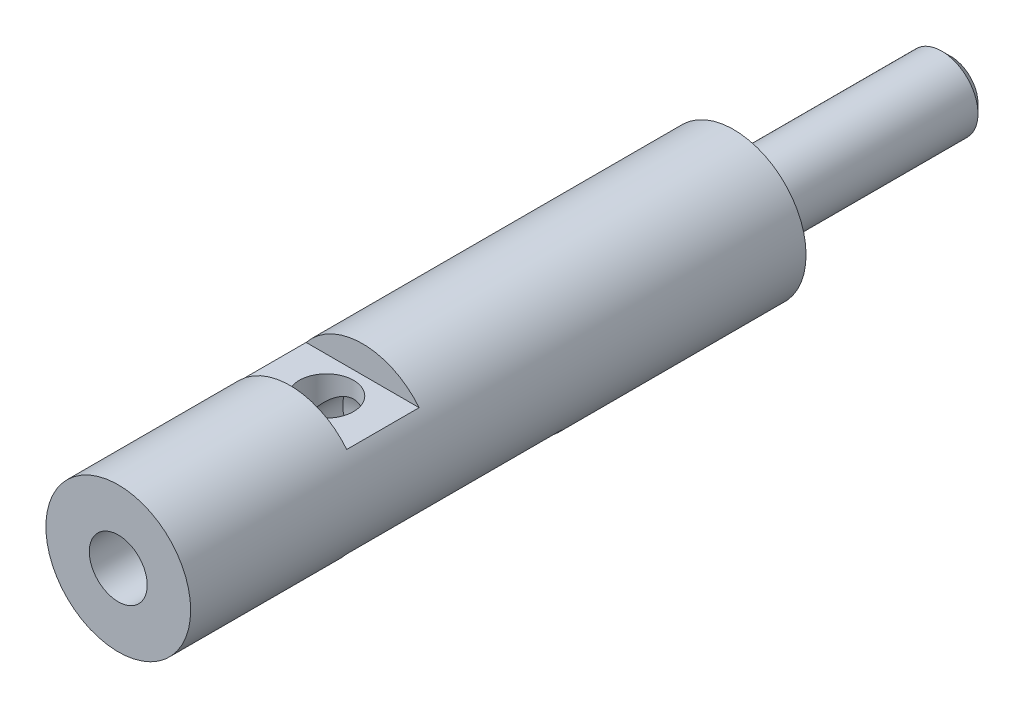
ISO-10303-21;
HEADER;
FILE_DESCRIPTION(('STEP AP214'),'2;1');
FILE_NAME('part.step','',(''),(''),'','','');
FILE_SCHEMA(('AUTOMOTIVE_DESIGN { 1 0 10303 214 1 1 1 1 }'));
ENDSEC;
DATA;
#1=APPLICATION_CONTEXT('core data for automotive mechanical design processes');
#2=APPLICATION_PROTOCOL_DEFINITION('international standard','automotive_design',2000,#1);
#3=PRODUCT_CONTEXT('',#1,'mechanical');
#4=PRODUCT('Part','Part','',(#3));
#5=PRODUCT_RELATED_PRODUCT_CATEGORY('part','',(#4));
#6=PRODUCT_DEFINITION_FORMATION('','',#4);
#7=PRODUCT_DEFINITION_CONTEXT('part definition',#1,'design');
#8=PRODUCT_DEFINITION('design','',#6,#7);
#9=PRODUCT_DEFINITION_SHAPE('','',#8);
#10=(LENGTH_UNIT() NAMED_UNIT(*) SI_UNIT(.MILLI.,.METRE.));
#11=(NAMED_UNIT(*) PLANE_ANGLE_UNIT() SI_UNIT($,.RADIAN.));
#12=(NAMED_UNIT(*) SI_UNIT($,.STERADIAN.) SOLID_ANGLE_UNIT());
#13=UNCERTAINTY_MEASURE_WITH_UNIT(LENGTH_MEASURE(1.E-05),#10,'distance_accuracy_value','');
#14=(GEOMETRIC_REPRESENTATION_CONTEXT(3) GLOBAL_UNCERTAINTY_ASSIGNED_CONTEXT((#13)) GLOBAL_UNIT_ASSIGNED_CONTEXT((#10,
#11,#12)) REPRESENTATION_CONTEXT('',''));
#15=CARTESIAN_POINT('',(0.,0.,0.));
#16=DIRECTION('',(0.,0.,1.));
#17=DIRECTION('',(1.,0.,0.));
#18=AXIS2_PLACEMENT_3D('',#15,#16,#17);
#19=CARTESIAN_POINT('',(0.,0.,34.));
#20=DIRECTION('',(0.,0.,-1.));
#21=DIRECTION('',(-1.,0.,0.));
#22=AXIS2_PLACEMENT_3D('',#19,#20,#21);
#23=CYLINDRICAL_SURFACE('',#22,4.);
#24=DIRECTION('',(0.,0.,-1.));
#25=VECTOR('',#24,1.);
#26=CARTESIAN_POINT('',(3.1224989991992,-2.5,34.));
#27=LINE('',#26,#25);
#28=CARTESIAN_POINT('',(3.1224989991992,-2.5,24.5));
#29=VERTEX_POINT('',#28);
#30=CARTESIAN_POINT('',(3.1224989991992,-2.5,12.5));
#31=VERTEX_POINT('',#30);
#32=EDGE_CURVE('E11',#29,#31,#27,.T.);
#33=ORIENTED_EDGE('',*,*,#32,.T.);
#34=CARTESIAN_POINT('',(0.,0.,12.5));
#35=DIRECTION('',(0.,0.,-1.));
#36=DIRECTION('',(-1.,0.,0.));
#37=AXIS2_PLACEMENT_3D('',#34,#35,#36);
#38=CIRCLE('',#37,4.);
#39=CARTESIAN_POINT('',(-3.1224989991992,-2.5,12.5));
#40=VERTEX_POINT('',#39);
#41=EDGE_CURVE('E99',#31,#40,#38,.T.);
#42=ORIENTED_EDGE('',*,*,#41,.T.);
#43=DIRECTION('',(0.,0.,-1.));
#44=VECTOR('',#43,1.);
#45=CARTESIAN_POINT('',(-3.1224989991992,-2.5,34.));
#46=LINE('',#45,#44);
#47=CARTESIAN_POINT('',(-3.1224989991992,-2.5,24.5));
#48=VERTEX_POINT('',#47);
#49=EDGE_CURVE('E102',#40,#48,#46,.F.);
#50=ORIENTED_EDGE('',*,*,#49,.T.);
#51=CARTESIAN_POINT('',(0.,0.,24.5));
#52=DIRECTION('',(0.,0.,1.));
#53=DIRECTION('',(1.,0.,0.));
#54=AXIS2_PLACEMENT_3D('',#51,#52,#53);
#55=CIRCLE('',#54,4.);
#56=EDGE_CURVE('E48',#48,#29,#55,.T.);
#57=ORIENTED_EDGE('',*,*,#56,.T.);
#58=EDGE_LOOP('',(#33,#42,#50,#57));
#59=FACE_BOUND('',#58,.T.);
#60=CARTESIAN_POINT('',(0.,0.,24.5));
#61=DIRECTION('',(0.,0.,1.));
#62=DIRECTION('',(1.,0.,0.));
#63=AXIS2_PLACEMENT_3D('',#60,#61,#62);
#64=CIRCLE('',#63,4.);
#65=CARTESIAN_POINT('',(3.1224989991992,2.5,24.5));
#66=VERTEX_POINT('',#65);
#67=CARTESIAN_POINT('',(-3.1224989991992,2.5,24.5));
#68=VERTEX_POINT('',#67);
#69=EDGE_CURVE('E92',#66,#68,#64,.T.);
#70=ORIENTED_EDGE('',*,*,#69,.T.);
#71=DIRECTION('',(0.,0.,-1.));
#72=VECTOR('',#71,1.);
#73=CARTESIAN_POINT('',(-3.1224989991992,2.5,34.));
#74=LINE('',#73,#72);
#75=CARTESIAN_POINT('',(-3.1224989991992,2.5,20.5));
#76=VERTEX_POINT('',#75);
#77=EDGE_CURVE('E96',#68,#76,#74,.T.);
#78=ORIENTED_EDGE('',*,*,#77,.T.);
#79=CARTESIAN_POINT('',(0.,0.,20.5));
#80=DIRECTION('',(0.,0.,-1.));
#81=DIRECTION('',(-1.,0.,0.));
#82=AXIS2_PLACEMENT_3D('',#79,#80,#81);
#83=CIRCLE('',#82,4.);
#84=CARTESIAN_POINT('',(3.1224989991992,2.5,20.5));
#85=VERTEX_POINT('',#84);
#86=EDGE_CURVE('E85',#76,#85,#83,.T.);
#87=ORIENTED_EDGE('',*,*,#86,.T.);
#88=DIRECTION('',(0.,0.,-1.));
#89=VECTOR('',#88,1.);
#90=CARTESIAN_POINT('',(3.1224989991992,2.5,34.));
#91=LINE('',#90,#89);
#92=EDGE_CURVE('E93',#85,#66,#91,.F.);
#93=ORIENTED_EDGE('',*,*,#92,.T.);
#94=EDGE_LOOP('',(#70,#78,#87,#93));
#95=FACE_BOUND('',#94,.T.);
#96=CARTESIAN_POINT('',(0.,0.,34.));
#97=DIRECTION('',(0.,0.,1.));
#98=DIRECTION('',(1.,0.,0.));
#99=AXIS2_PLACEMENT_3D('',#96,#97,#98);
#100=CIRCLE('',#99,4.);
#101=CARTESIAN_POINT('',(4.,0.,34.));
#102=VERTEX_POINT('',#101);
#103=EDGE_CURVE('E139',#102,#102,#100,.T.);
#104=ORIENTED_EDGE('',*,*,#103,.F.);
#105=EDGE_LOOP('',(#104));
#106=FACE_BOUND('',#105,.T.);
#107=CARTESIAN_POINT('',(0.,0.,0.));
#108=DIRECTION('',(0.,0.,1.));
#109=DIRECTION('',(1.,0.,0.));
#110=AXIS2_PLACEMENT_3D('',#107,#108,#109);
#111=CIRCLE('',#110,4.);
#112=CARTESIAN_POINT('',(4.,0.,0.));
#113=VERTEX_POINT('',#112);
#114=EDGE_CURVE('E134',#113,#113,#111,.T.);
#115=ORIENTED_EDGE('',*,*,#114,.T.);
#116=EDGE_LOOP('',(#115));
#117=FACE_BOUND('',#116,.T.);
#118=ADVANCED_FACE('F39',(#59,#95,#106,#117),#23,.T.);
#119=CARTESIAN_POINT('',(0.,0.,34.));
#120=DIRECTION('',(0.,0.,1.));
#121=DIRECTION('',(1.,0.,0.));
#122=AXIS2_PLACEMENT_3D('',#119,#120,#121);
#123=PLANE('',#122);
#124=CARTESIAN_POINT('',(0.,0.,34.));
#125=DIRECTION('',(0.,0.,1.));
#126=DIRECTION('',(1.,0.,0.));
#127=AXIS2_PLACEMENT_3D('',#124,#125,#126);
#128=CIRCLE('',#127,1.59999999999999);
#129=CARTESIAN_POINT('',(1.59999999999999,0.,34.));
#130=VERTEX_POINT('',#129);
#131=EDGE_CURVE('E116',#130,#130,#128,.T.);
#132=ORIENTED_EDGE('',*,*,#131,.F.);
#133=EDGE_LOOP('',(#132));
#134=FACE_BOUND('',#133,.T.);
#135=ORIENTED_EDGE('',*,*,#103,.T.);
#136=EDGE_LOOP('',(#135));
#137=FACE_BOUND('',#136,.T.);
#138=ADVANCED_FACE('F169',(#134,#137),#123,.T.);
#139=CARTESIAN_POINT('',(0.,0.,0.));
#140=DIRECTION('',(0.,0.,1.));
#141=DIRECTION('',(1.,0.,0.));
#142=AXIS2_PLACEMENT_3D('',#139,#140,#141);
#143=PLANE('',#142);
#144=CARTESIAN_POINT('',(0.,0.,0.));
#145=DIRECTION('',(0.,0.,-1.));
#146=DIRECTION('',(-1.,0.,0.));
#147=AXIS2_PLACEMENT_3D('',#144,#145,#146);
#148=CIRCLE('',#147,2.);
#149=CARTESIAN_POINT('',(-2.,0.,0.));
#150=VERTEX_POINT('',#149);
#151=EDGE_CURVE('E135',#150,#150,#148,.T.);
#152=ORIENTED_EDGE('',*,*,#151,.F.);
#153=EDGE_LOOP('',(#152));
#154=FACE_BOUND('',#153,.T.);
#155=ORIENTED_EDGE('',*,*,#114,.F.);
#156=EDGE_LOOP('',(#155));
#157=FACE_BOUND('',#156,.T.);
#158=ADVANCED_FACE('F165',(#154,#157),#143,.F.);
#159=CARTESIAN_POINT('',(0.,0.,-12.));
#160=DIRECTION('',(0.,0.,1.));
#161=DIRECTION('',(1.,0.,0.));
#162=AXIS2_PLACEMENT_3D('',#159,#160,#161);
#163=CYLINDRICAL_SURFACE('',#162,2.);
#164=CARTESIAN_POINT('',(0.,0.,-11.5));
#165=DIRECTION('',(0.,0.,-1.));
#166=DIRECTION('',(-1.,0.,0.));
#167=AXIS2_PLACEMENT_3D('',#164,#165,#166);
#168=CIRCLE('',#167,2.);
#169=CARTESIAN_POINT('',(-2.,0.,-11.5));
#170=VERTEX_POINT('',#169);
#171=EDGE_CURVE('E146',#170,#170,#168,.F.);
#172=ORIENTED_EDGE('',*,*,#171,.T.);
#173=EDGE_LOOP('',(#172));
#174=FACE_BOUND('',#173,.T.);
#175=ORIENTED_EDGE('',*,*,#151,.T.);
#176=EDGE_LOOP('',(#175));
#177=FACE_BOUND('',#176,.T.);
#178=ADVANCED_FACE('F151',(#174,#177),#163,.T.);
#179=CARTESIAN_POINT('',(0.,0.,-12.));
#180=DIRECTION('',(0.,0.,-1.));
#181=DIRECTION('',(-1.,0.,0.));
#182=AXIS2_PLACEMENT_3D('',#179,#180,#181);
#183=PLANE('',#182);
#184=CARTESIAN_POINT('',(0.,0.,-12.));
#185=DIRECTION('',(0.,0.,-1.));
#186=DIRECTION('',(-1.,0.,0.));
#187=AXIS2_PLACEMENT_3D('',#184,#185,#186);
#188=CIRCLE('',#187,1.5);
#189=CARTESIAN_POINT('',(-1.5,0.,-12.));
#190=VERTEX_POINT('',#189);
#191=EDGE_CURVE('E138',#190,#190,#188,.T.);
#192=ORIENTED_EDGE('',*,*,#191,.T.);
#193=EDGE_LOOP('',(#192));
#194=FACE_BOUND('',#193,.T.);
#195=ADVANCED_FACE('F157',(#194),#183,.T.);
#196=CARTESIAN_POINT('',(0.,0.,-12.));
#197=DIRECTION('',(0.,0.,1.));
#198=DIRECTION('',(1.,0.,0.));
#199=AXIS2_PLACEMENT_3D('',#196,#197,#198);
#200=CONICAL_SURFACE('',#199,1.5,0.785398163397441);
#201=ORIENTED_EDGE('',*,*,#171,.F.);
#202=EDGE_LOOP('',(#201));
#203=FACE_BOUND('',#202,.T.);
#204=ORIENTED_EDGE('',*,*,#191,.F.);
#205=EDGE_LOOP('',(#204));
#206=FACE_BOUND('',#205,.T.);
#207=ADVANCED_FACE('F42',(#203,#206),#200,.T.);
#208=CARTESIAN_POINT('',(0.,0.,20.));
#209=DIRECTION('',(0.,0.,1.));
#210=DIRECTION('',(1.,0.,0.));
#211=AXIS2_PLACEMENT_3D('',#208,#209,#210);
#212=CONICAL_SURFACE('',#211,1.6,1.02974425867665);
#213=CARTESIAN_POINT('',(0.,0.,19.0386230095559));
#214=VERTEX_POINT('',#213);
#215=VERTEX_LOOP('',#214);
#216=FACE_BOUND('',#215,.T.);
#217=CARTESIAN_POINT('',(0.,0.,20.));
#218=DIRECTION('',(0.,0.,1.));
#219=DIRECTION('',(1.,0.,0.));
#220=AXIS2_PLACEMENT_3D('',#217,#218,#219);
#221=CIRCLE('',#220,1.6);
#222=CARTESIAN_POINT('',(1.6,0.,20.));
#223=VERTEX_POINT('',#222);
#224=EDGE_CURVE('E119',#223,#223,#221,.T.);
#225=ORIENTED_EDGE('',*,*,#224,.T.);
#226=EDGE_LOOP('',(#225));
#227=FACE_BOUND('',#226,.T.);
#228=ADVANCED_FACE('F156',(#216,#227),#212,.F.);
#229=CARTESIAN_POINT('',(0.,0.,34.));
#230=DIRECTION('',(0.,0.,1.));
#231=DIRECTION('',(1.,0.,0.));
#232=AXIS2_PLACEMENT_3D('',#229,#230,#231);
#233=CYLINDRICAL_SURFACE('',#232,1.59999999999999);
#234=CARTESIAN_POINT('',(0.,1.59999999999999,24.));
#235=CARTESIAN_POINT('',(0.0684255819523122,1.59999100993067,23.9999909037022));
#236=CARTESIAN_POINT('',(0.136969761419658,1.59556467819543,23.9952718028662));
#237=CARTESIAN_POINT('',(0.271820864103849,1.57821703920185,23.9767460950131));
#238=CARTESIAN_POINT('',(0.338120531372212,1.56527051953187,23.9629125168593));
#239=CARTESIAN_POINT('',(0.466029039157558,1.53204181361779,23.9273026465164));
#240=CARTESIAN_POINT('',(0.527667983699462,1.51181264687308,23.9055837519526));
#241=CARTESIAN_POINT('',(0.645624057326148,1.46533125031908,23.8554641980768));
#242=CARTESIAN_POINT('',(0.701942648568488,1.43908068217026,23.827065382095));
#243=CARTESIAN_POINT('',(0.830488511004105,1.37023549959972,23.7521367718335));
#244=CARTESIAN_POINT('',(0.899909356040595,1.32532924968791,23.7029239827119));
#245=CARTESIAN_POINT('',(1.02730053831725,1.22924745848653,23.5961763274232));
#246=CARTESIAN_POINT('',(1.08523092595497,1.17805101301526,23.5386135908392));
#247=CARTESIAN_POINT('',(1.17078105057247,1.09156202300322,23.439079203753));
#248=CARTESIAN_POINT('',(1.20175833727903,1.05726375119173,23.3990591913821));
#249=CARTESIAN_POINT('',(1.25930890566738,0.988010810145917,23.3165013666502));
#250=CARTESIAN_POINT('',(1.28588281199331,0.953056234796473,23.2739639125663));
#251=CARTESIAN_POINT('',(1.33467012957743,0.883435608136693,23.1864135331328));
#252=CARTESIAN_POINT('',(1.35689236994422,0.848769112188214,23.1414058623666));
#253=CARTESIAN_POINT('',(1.39703622789021,0.780917148192493,23.0485005487822));
#254=CARTESIAN_POINT('',(1.4149635108398,0.747729776660345,23.0006068184924));
#255=CARTESIAN_POINT('',(1.44158488802393,0.694574099514457,22.9161177140525));
#256=CARTESIAN_POINT('',(1.45143080990949,0.673647073701062,22.8804953894909));
#257=CARTESIAN_POINT('',(1.46874054388632,0.635016088570959,22.8069631663552));
#258=CARTESIAN_POINT('',(1.47620697945578,0.617308588918451,22.7690558423236));
#259=CARTESIAN_POINT('',(1.48710185280875,0.590503680558253,22.6987798427245));
#260=CARTESIAN_POINT('',(1.49104694938892,0.580381760051782,22.6668967764258));
#261=CARTESIAN_POINT('',(1.49689488628612,0.565132788162447,22.6018105489845));
#262=CARTESIAN_POINT('',(1.49880415766172,0.559990012702319,22.56861189048));
#263=CARTESIAN_POINT('',(1.50037685312532,0.55576681639676,22.5014829327953));
#264=CARTESIAN_POINT('',(1.50002232907756,0.556734843369684,22.4675489177339));
#265=CARTESIAN_POINT('',(1.49707243273785,0.564613886898902,22.4004548043569));
#266=CARTESIAN_POINT('',(1.49447189716921,0.57153859691651,22.3672966702138));
#267=CARTESIAN_POINT('',(1.48583868780731,0.593691355415249,22.2892934477393));
#268=CARTESIAN_POINT('',(1.47883660489909,0.611158481279117,22.2452232391712));
#269=CARTESIAN_POINT('',(1.46163501869307,0.651230780563995,22.1601115299857));
#270=CARTESIAN_POINT('',(1.45142140048049,0.673858512219678,22.1190844071592));
#271=CARTESIAN_POINT('',(1.42705633043943,0.724130291338588,22.035704865551));
#272=CARTESIAN_POINT('',(1.41262082836606,0.752047417768084,21.9936038116937));
#273=CARTESIAN_POINT('',(1.38053670392534,0.809448984794801,21.9117405374917));
#274=CARTESIAN_POINT('',(1.36288484352601,0.838934983462933,21.8719807280305));
#275=CARTESIAN_POINT('',(1.3051305530831,0.928246532931989,21.7555777713488));
#276=CARTESIAN_POINT('',(1.26024681474811,0.988886891758775,21.6818687836925));
#277=CARTESIAN_POINT('',(1.15222226148889,1.11350800341083,21.5348573565179));
#278=CARTESIAN_POINT('',(1.08770668085877,1.17721837960241,21.4623292339281));
#279=CARTESIAN_POINT('',(0.941971511717624,1.29672721862757,21.3285064688438));
#280=CARTESIAN_POINT('',(0.860815124216925,1.35255430540365,21.2671709361242));
#281=CARTESIAN_POINT('',(0.715544871064882,1.43250376355303,21.1800618011488));
#282=CARTESIAN_POINT('',(0.656464639142303,1.46066194156336,21.1495806370149));
#283=CARTESIAN_POINT('',(0.53238020259496,1.51030557076396,21.0960323247324));
#284=CARTESIAN_POINT('',(0.467379935912636,1.53179541632511,21.0729602936807));
#285=CARTESIAN_POINT('',(0.332158679533443,1.56671039192709,21.035545587034));
#286=CARTESIAN_POINT('',(0.26189842930266,1.58006627656505,21.0212778502644));
#287=CARTESIAN_POINT('',(0.118916949535143,1.59719349756616,21.0029903622693));
#288=CARTESIAN_POINT('',(0.0461977442778746,1.60097253214485,20.9989623799539));
#289=CARTESIAN_POINT('',(-0.0898241742949434,1.5987422645432,21.0013418095769));
#290=CARTESIAN_POINT('',(-0.153173912852346,1.59389115980747,21.0065144481242));
#291=CARTESIAN_POINT('',(-0.27775368533369,1.57696068243675,21.024596634228));
#292=CARTESIAN_POINT('',(-0.338983446812133,1.56488038437404,21.0375071723332));
#293=CARTESIAN_POINT('',(-0.457735986419081,1.53435147837037,21.0702206863653));
#294=CARTESIAN_POINT('',(-0.515265285072311,1.51591445776733,21.0900111218264));
#295=CARTESIAN_POINT('',(-0.625826321394385,1.47371929048371,21.1354781195557));
#296=CARTESIAN_POINT('',(-0.678856869780216,1.44995974275386,21.1611562316796));
#297=CARTESIAN_POINT('',(-0.804323666257112,1.38569203947422,21.2309805354634));
#298=CARTESIAN_POINT('',(-0.873816485374875,1.34262645456977,21.2780673078644));
#299=CARTESIAN_POINT('',(-1.00176463057466,1.25009328041172,21.3805237816003));
#300=CARTESIAN_POINT('',(-1.06018192297004,1.20060457993999,21.4359208949526));
#301=CARTESIAN_POINT('',(-1.14747741148049,1.11605538641915,21.5325729352821));
#302=CARTESIAN_POINT('',(-1.17951966582666,1.08204019580844,21.5719515075108));
#303=CARTESIAN_POINT('',(-1.23917518469033,1.01317225735416,21.6532484412366));
#304=CARTESIAN_POINT('',(-1.26678887424384,0.978319590257867,21.6951665584654));
#305=CARTESIAN_POINT('',(-1.31764191463907,0.908666765165565,21.781443307152));
#306=CARTESIAN_POINT('',(-1.34088972001461,0.873866637883977,21.8257970021608));
#307=CARTESIAN_POINT('',(-1.38309994332714,0.805383294233531,21.9172701015335));
#308=CARTESIAN_POINT('',(-1.40206704077597,0.771698892914984,21.9643864141986));
#309=CARTESIAN_POINT('',(-1.43080243256964,0.716573830570101,22.0481565996484));
#310=CARTESIAN_POINT('',(-1.44164985062665,0.694387989717431,22.0839457991879));
#311=CARTESIAN_POINT('',(-1.46094173101545,0.652817311175948,22.157791638766));
#312=CARTESIAN_POINT('',(-1.46938663186735,0.63343196264484,22.1958478634798));
#313=CARTESIAN_POINT('',(-1.48226072963674,0.602605017567062,22.2676546852014));
#314=CARTESIAN_POINT('',(-1.4871367841298,0.590364021627843,22.3009692785519));
#315=CARTESIAN_POINT('',(-1.49468197065955,0.570995915270091,22.3692475076415));
#316=CARTESIAN_POINT('',(-1.49735937115688,0.563849658605718,22.4042044375228));
#317=CARTESIAN_POINT('',(-1.50022554535816,0.556188195946332,22.4754431877136));
#318=CARTESIAN_POINT('',(-1.50038283453941,0.555756883688066,22.511736099773));
#319=CARTESIAN_POINT('',(-1.49809981486309,0.561875339118336,22.5836674183881));
#320=CARTESIAN_POINT('',(-1.49565398700772,0.568439939227101,22.619304270735));
#321=CARTESIAN_POINT('',(-1.48749788637684,0.589493082818556,22.6983436350826));
#322=CARTESIAN_POINT('',(-1.48107662983667,0.605660277513032,22.7411975553228));
#323=CARTESIAN_POINT('',(-1.46519284514556,0.643137620116834,22.824042461153));
#324=CARTESIAN_POINT('',(-1.45571686428682,0.664470411421145,22.8640198078219));
#325=CARTESIAN_POINT('',(-1.43308878736763,0.712049693883315,22.9451870246481));
#326=CARTESIAN_POINT('',(-1.41967554469701,0.738569250729486,22.9861398801734));
#327=CARTESIAN_POINT('',(-1.38985030146091,0.793280785771165,23.0657938219043));
#328=CARTESIAN_POINT('',(-1.37343521142804,0.821474466580539,23.1044925335633));
#329=CARTESIAN_POINT('',(-1.31974256303736,0.907082200617748,23.2178410452129));
#330=CARTESIAN_POINT('',(-1.2780328332995,0.965488439995827,23.2896905868108));
#331=CARTESIAN_POINT('',(-1.17693332909143,1.08712656870907,23.4346161435188));
#332=CARTESIAN_POINT('',(-1.1160448400042,1.15012229053257,23.5068499125272));
#333=CARTESIAN_POINT('',(-0.978384321159532,1.26925092061591,23.6410250385639));
#334=CARTESIAN_POINT('',(-0.901663440053396,1.32540502482405,23.7029984090641));
#335=CARTESIAN_POINT('',(-0.761516551758936,1.408636613547,23.7940099454182));
#336=CARTESIAN_POINT('',(-0.702656139422111,1.43905674895608,23.8270292527893));
#337=CARTESIAN_POINT('',(-0.57847715284501,1.49329683004649,23.8856626776549));
#338=CARTESIAN_POINT('',(-0.513162974258343,1.51712122660307,23.9112817893895));
#339=CARTESIAN_POINT('',(-0.386200408140193,1.55390938239855,23.9507507495729));
#340=CARTESIAN_POINT('',(-0.32518909083167,1.56788580592606,23.9657013766045));
#341=CARTESIAN_POINT('',(-0.200670425393327,1.58861097203542,23.9878510446114));
#342=CARTESIAN_POINT('',(-0.13717048781781,1.5953796997283,23.9950715196375));
#343=CARTESIAN_POINT('',(-0.0489577110307142,1.59944074803712,23.9994033455608));
#344=CARTESIAN_POINT('',(-0.0244864493340456,1.60000321714292,24.0000032551573));
#345=CARTESIAN_POINT('',(0.,1.59999999999999,24.));
#346=B_SPLINE_CURVE_WITH_KNOTS('',3,(#234,#235,#236,#237,#238,#239,#240,#241,#242,#243,#244,
#245,#246,#247,#248,#249,#250,#251,#252,#253,#254,#255,#256,#257,#258,#259,#260,#261,#262,#263,
#264,#265,#266,#267,#268,#269,#270,#271,#272,#273,#274,#275,#276,#277,#278,#279,#280,#281,#282,
#283,#284,#285,#286,#287,#288,#289,#290,#291,#292,#293,#294,#295,#296,#297,#298,#299,#300,#301,
#302,#303,#304,#305,#306,#307,#308,#309,#310,#311,#312,#313,#314,#315,#316,#317,#318,#319,#320,
#321,#322,#323,#324,#325,#326,#327,#328,#329,#330,#331,#332,#333,#334,#335,#336,#337,#338,#339,
#340,#341,#342,#343,#344,#345),.UNSPECIFIED.,.T.,.F.,(4,2,2,2,2,2,2,2,2,2,2,2,2,2,2,2,2,2,2,2,2,
2,2,2,2,2,2,2,2,2,2,2,2,2,2,2,2,2,2,2,2,2,2,2,2,2,2,2,2,2,2,2,2,2,2,4),(0.,0.205191194350401,
0.410992324539083,0.615324504475546,0.819600364781852,1.10668891633045,1.39475875441688,
1.57797159708169,1.76115842768929,1.94396964900547,2.1265383843133,2.25379522043879,
2.38091126151401,2.48161669197437,2.58200304846303,2.68318628478434,2.78460274869496,
2.92755182236974,3.07113816175826,3.22851946560475,3.38606009559673,3.70135424338247,
4.04810638258297,4.393565187512,4.6093826916077,4.82505767038771,5.04254394703591,
5.2598553448823,5.4501575115817,5.64048404456583,5.83046545960808,6.0204969423605,
6.30198386380246,6.58442057318486,6.76754781754566,6.95065747555075,7.13340880043481,
7.31595937010022,7.44626722225469,7.57655127464999,7.68369231421017,7.79042855986852,
7.89849726875139,8.00679555674798,8.14477595318693,8.28337249894484,8.43494757827371,
8.58667954401142,8.89033594061588,9.22956287389842,9.5677105805249,9.78902158846354,
10.0101828873086,10.2024308125783,10.3941442839537,10.4675730169056),.UNSPECIFIED.);
#347=CARTESIAN_POINT('',(0.,1.59999999999999,24.));
#348=VERTEX_POINT('',#347);
#349=EDGE_CURVE('E123',#348,#348,#346,.T.);
#350=ORIENTED_EDGE('',*,*,#349,.T.);
#351=EDGE_LOOP('',(#350));
#352=FACE_BOUND('',#351,.T.);
#353=ORIENTED_EDGE('',*,*,#224,.F.);
#354=EDGE_LOOP('',(#353));
#355=FACE_BOUND('',#354,.T.);
#356=ORIENTED_EDGE('',*,*,#131,.T.);
#357=EDGE_LOOP('',(#356));
#358=FACE_BOUND('',#357,.T.);
#359=ADVANCED_FACE('F213',(#352,#355,#358),#233,.F.);
#360=CARTESIAN_POINT('',(-4.,4.,24.5));
#361=DIRECTION('',(0.,0.,1.));
#362=DIRECTION('',(1.,0.,0.));
#363=AXIS2_PLACEMENT_3D('',#360,#361,#362);
#364=PLANE('',#363);
#365=DIRECTION('',(1.,0.,0.));
#366=VECTOR('',#365,1.);
#367=CARTESIAN_POINT('',(-4.,2.5,24.5));
#368=LINE('',#367,#366);
#369=EDGE_CURVE('E62',#68,#66,#368,.T.);
#370=ORIENTED_EDGE('',*,*,#369,.F.);
#371=ORIENTED_EDGE('',*,*,#69,.F.);
#372=EDGE_LOOP('',(#370,#371));
#373=FACE_BOUND('',#372,.T.);
#374=ADVANCED_FACE('F224',(#373),#364,.F.);
#375=CARTESIAN_POINT('',(-4.,4.,20.5));
#376=DIRECTION('',(0.,0.,-1.));
#377=DIRECTION('',(-1.,0.,0.));
#378=AXIS2_PLACEMENT_3D('',#375,#376,#377);
#379=PLANE('',#378);
#380=DIRECTION('',(1.,0.,0.));
#381=VECTOR('',#380,1.);
#382=CARTESIAN_POINT('',(-4.,2.5,20.5));
#383=LINE('',#382,#381);
#384=EDGE_CURVE('E88',#76,#85,#383,.T.);
#385=ORIENTED_EDGE('',*,*,#384,.T.);
#386=ORIENTED_EDGE('',*,*,#86,.F.);
#387=EDGE_LOOP('',(#385,#386));
#388=FACE_BOUND('',#387,.T.);
#389=ADVANCED_FACE('F87',(#388),#379,.F.);
#390=CARTESIAN_POINT('',(-4.,2.5,24.5));
#391=DIRECTION('',(0.,-1.,0.));
#392=DIRECTION('',(0.,0.,-1.));
#393=AXIS2_PLACEMENT_3D('',#390,#391,#392);
#394=PLANE('',#393);
#395=CARTESIAN_POINT('',(0.,2.5,22.5));
#396=DIRECTION('',(0.,1.,0.));
#397=DIRECTION('',(0.,0.,1.));
#398=AXIS2_PLACEMENT_3D('',#395,#396,#397);
#399=CIRCLE('',#398,1.49999999999999);
#400=CARTESIAN_POINT('',(0.,2.5,24.));
#401=VERTEX_POINT('',#400);
#402=EDGE_CURVE('E298',#401,#401,#399,.T.);
#403=ORIENTED_EDGE('',*,*,#402,.F.);
#404=EDGE_LOOP('',(#403));
#405=FACE_BOUND('',#404,.T.);
#406=ORIENTED_EDGE('',*,*,#369,.T.);
#407=ORIENTED_EDGE('',*,*,#92,.F.);
#408=ORIENTED_EDGE('',*,*,#384,.F.);
#409=ORIENTED_EDGE('',*,*,#77,.F.);
#410=EDGE_LOOP('',(#406,#407,#408,#409));
#411=FACE_BOUND('',#410,.T.);
#412=ADVANCED_FACE('F95',(#405,#411),#394,.F.);
#413=CARTESIAN_POINT('',(-4.,-4.,24.5));
#414=DIRECTION('',(0.,0.,1.));
#415=DIRECTION('',(1.,0.,0.));
#416=AXIS2_PLACEMENT_3D('',#413,#414,#415);
#417=PLANE('',#416);
#418=DIRECTION('',(1.,0.,0.));
#419=VECTOR('',#418,1.);
#420=CARTESIAN_POINT('',(-4.,-2.5,24.5));
#421=LINE('',#420,#419);
#422=EDGE_CURVE('E113',#48,#29,#421,.T.);
#423=ORIENTED_EDGE('',*,*,#422,.T.);
#424=ORIENTED_EDGE('',*,*,#56,.F.);
#425=EDGE_LOOP('',(#423,#424));
#426=FACE_BOUND('',#425,.T.);
#427=ADVANCED_FACE('F112',(#426),#417,.F.);
#428=CARTESIAN_POINT('',(-4.,-2.5,24.5));
#429=DIRECTION('',(0.,1.,0.));
#430=DIRECTION('',(0.,0.,1.));
#431=AXIS2_PLACEMENT_3D('',#428,#429,#430);
#432=PLANE('',#431);
#433=ORIENTED_EDGE('',*,*,#422,.F.);
#434=ORIENTED_EDGE('',*,*,#49,.F.);
#435=DIRECTION('',(1.,0.,0.));
#436=VECTOR('',#435,1.);
#437=CARTESIAN_POINT('',(-4.,-2.5,12.5));
#438=LINE('',#437,#436);
#439=EDGE_CURVE('E54',#40,#31,#438,.T.);
#440=ORIENTED_EDGE('',*,*,#439,.T.);
#441=ORIENTED_EDGE('',*,*,#32,.F.);
#442=EDGE_LOOP('',(#433,#434,#440,#441));
#443=FACE_BOUND('',#442,.T.);
#444=ADVANCED_FACE('F115',(#443),#432,.F.);
#445=CARTESIAN_POINT('',(-4.,-4.,12.5));
#446=DIRECTION('',(0.,0.,-1.));
#447=DIRECTION('',(-1.,0.,0.));
#448=AXIS2_PLACEMENT_3D('',#445,#446,#447);
#449=PLANE('',#448);
#450=ORIENTED_EDGE('',*,*,#439,.F.);
#451=ORIENTED_EDGE('',*,*,#41,.F.);
#452=EDGE_LOOP('',(#450,#451));
#453=FACE_BOUND('',#452,.T.);
#454=ADVANCED_FACE('F256',(#453),#449,.F.);
#455=CARTESIAN_POINT('',(0.,2.5,22.5));
#456=DIRECTION('',(0.,1.,0.));
#457=DIRECTION('',(0.,0.,1.));
#458=AXIS2_PLACEMENT_3D('',#455,#456,#457);
#459=CYLINDRICAL_SURFACE('',#458,1.49999999999999);
#460=ORIENTED_EDGE('',*,*,#349,.F.);
#461=EDGE_LOOP('',(#460));
#462=FACE_BOUND('',#461,.T.);
#463=ORIENTED_EDGE('',*,*,#402,.T.);
#464=EDGE_LOOP('',(#463));
#465=FACE_BOUND('',#464,.T.);
#466=ADVANCED_FACE('F265',(#462,#465),#459,.F.);
#467=CLOSED_SHELL('',(#118,#138,#158,#178,#195,#207,#228,#359,#374,#389,#412,#427,#444,#454,#466));
#468=MANIFOLD_SOLID_BREP('B2',#467);
#469=ADVANCED_BREP_SHAPE_REPRESENTATION('',(#18,#468),#14);
#470=SHAPE_DEFINITION_REPRESENTATION(#9,#469);
ENDSEC;
END-ISO-10303-21;
